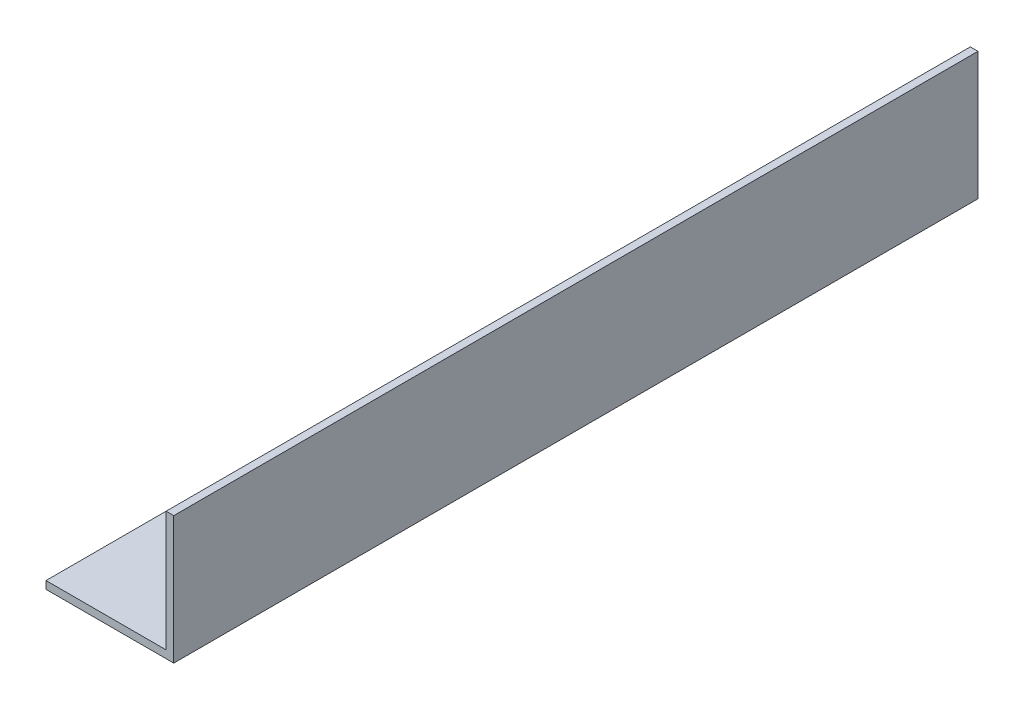
ISO-10303-21;
HEADER;
FILE_DESCRIPTION(('STEP AP214'),'2;1');
FILE_NAME('part.step','',(''),(''),'','','');
FILE_SCHEMA(('AUTOMOTIVE_DESIGN { 1 0 10303 214 1 1 1 1 }'));
ENDSEC;
DATA;
#1=APPLICATION_CONTEXT('core data for automotive mechanical design processes');
#2=APPLICATION_PROTOCOL_DEFINITION('international standard','automotive_design',2000,#1);
#3=PRODUCT_CONTEXT('',#1,'mechanical');
#4=PRODUCT('Part','Part','',(#3));
#5=PRODUCT_RELATED_PRODUCT_CATEGORY('part','',(#4));
#6=PRODUCT_DEFINITION_FORMATION('','',#4);
#7=PRODUCT_DEFINITION_CONTEXT('part definition',#1,'design');
#8=PRODUCT_DEFINITION('design','',#6,#7);
#9=PRODUCT_DEFINITION_SHAPE('','',#8);
#10=(LENGTH_UNIT() NAMED_UNIT(*) SI_UNIT(.MILLI.,.METRE.));
#11=(NAMED_UNIT(*) PLANE_ANGLE_UNIT() SI_UNIT($,.RADIAN.));
#12=(NAMED_UNIT(*) SI_UNIT($,.STERADIAN.) SOLID_ANGLE_UNIT());
#13=UNCERTAINTY_MEASURE_WITH_UNIT(LENGTH_MEASURE(1.E-05),#10,'distance_accuracy_value','');
#14=(GEOMETRIC_REPRESENTATION_CONTEXT(3) GLOBAL_UNCERTAINTY_ASSIGNED_CONTEXT((#13)) GLOBAL_UNIT_ASSIGNED_CONTEXT((#10,
#11,#12)) REPRESENTATION_CONTEXT('',''));
#15=CARTESIAN_POINT('',(0.,0.,0.));
#16=DIRECTION('',(0.,0.,1.));
#17=DIRECTION('',(1.,0.,0.));
#18=AXIS2_PLACEMENT_3D('',#15,#16,#17);
#19=CARTESIAN_POINT('',(-50.,0.,-304.8));
#20=DIRECTION('',(-1.,0.,0.));
#21=DIRECTION('',(0.,0.,1.));
#22=AXIS2_PLACEMENT_3D('',#19,#20,#21);
#23=PLANE('',#22);
#24=DIRECTION('',(0.,0.,1.));
#25=VECTOR('',#24,1.);
#26=CARTESIAN_POINT('',(-50.,0.,-304.8));
#27=LINE('',#26,#25);
#28=CARTESIAN_POINT('',(-50.,0.,-304.8));
#29=VERTEX_POINT('',#28);
#30=CARTESIAN_POINT('',(-50.,0.,10.));
#31=VERTEX_POINT('',#30);
#32=EDGE_CURVE('E44',#29,#31,#27,.T.);
#33=ORIENTED_EDGE('',*,*,#32,.T.);
#34=DIRECTION('',(0.,-1.,0.));
#35=VECTOR('',#34,1.);
#36=CARTESIAN_POINT('',(-50.,0.,10.));
#37=LINE('',#36,#35);
#38=CARTESIAN_POINT('',(-50.,2.99999999999999,10.));
#39=VERTEX_POINT('',#38);
#40=EDGE_CURVE('E93',#39,#31,#37,.T.);
#41=ORIENTED_EDGE('',*,*,#40,.F.);
#42=DIRECTION('',(0.,0.,1.));
#43=VECTOR('',#42,1.);
#44=CARTESIAN_POINT('',(-50.,2.99999999999999,-304.8));
#45=LINE('',#44,#43);
#46=CARTESIAN_POINT('',(-50.,2.99999999999999,-304.8));
#47=VERTEX_POINT('',#46);
#48=EDGE_CURVE('E11',#47,#39,#45,.T.);
#49=ORIENTED_EDGE('',*,*,#48,.F.);
#50=DIRECTION('',(0.,-1.,0.));
#51=VECTOR('',#50,1.);
#52=CARTESIAN_POINT('',(-50.,0.,-304.8));
#53=LINE('',#52,#51);
#54=EDGE_CURVE('E94',#47,#29,#53,.T.);
#55=ORIENTED_EDGE('',*,*,#54,.T.);
#56=EDGE_LOOP('',(#33,#41,#49,#55));
#57=FACE_BOUND('',#56,.T.);
#58=ADVANCED_FACE('F41',(#57),#23,.T.);
#59=CARTESIAN_POINT('',(-2.99999999999999,3.,-304.8));
#60=DIRECTION('',(0.,1.,0.));
#61=DIRECTION('',(-1.,0.,0.));
#62=AXIS2_PLACEMENT_3D('',#59,#60,#61);
#63=PLANE('',#62);
#64=CARTESIAN_POINT('',(-37.,3.,-110.61));
#65=DIRECTION('',(0.,1.,0.));
#66=DIRECTION('',(-1.,0.,0.));
#67=AXIS2_PLACEMENT_3D('',#64,#65,#66);
#68=CIRCLE('',#67,2.58499999999999);
#69=CARTESIAN_POINT('',(-39.585,3.,-110.61));
#70=VERTEX_POINT('',#69);
#71=EDGE_CURVE('E112',#70,#70,#68,.F.);
#72=ORIENTED_EDGE('',*,*,#71,.T.);
#73=EDGE_LOOP('',(#72));
#74=FACE_BOUND('',#73,.T.);
#75=CARTESIAN_POINT('',(-16.,3.,-184.19));
#76=DIRECTION('',(0.,1.,0.));
#77=DIRECTION('',(-1.,0.,0.));
#78=AXIS2_PLACEMENT_3D('',#75,#76,#77);
#79=CIRCLE('',#78,2.58499999999999);
#80=CARTESIAN_POINT('',(-18.585,3.,-184.19));
#81=VERTEX_POINT('',#80);
#82=EDGE_CURVE('E115',#81,#81,#79,.F.);
#83=ORIENTED_EDGE('',*,*,#82,.T.);
#84=EDGE_LOOP('',(#83));
#85=FACE_BOUND('',#84,.T.);
#86=CARTESIAN_POINT('',(-37.,3.,-184.19));
#87=DIRECTION('',(0.,1.,0.));
#88=DIRECTION('',(-1.,0.,0.));
#89=AXIS2_PLACEMENT_3D('',#86,#87,#88);
#90=CIRCLE('',#89,2.58499999999999);
#91=CARTESIAN_POINT('',(-39.585,3.,-184.19));
#92=VERTEX_POINT('',#91);
#93=EDGE_CURVE('E230',#92,#92,#90,.F.);
#94=ORIENTED_EDGE('',*,*,#93,.T.);
#95=EDGE_LOOP('',(#94));
#96=FACE_BOUND('',#95,.T.);
#97=CARTESIAN_POINT('',(-16.,3.,-156.19));
#98=DIRECTION('',(0.,1.,0.));
#99=DIRECTION('',(-1.,0.,0.));
#100=AXIS2_PLACEMENT_3D('',#97,#98,#99);
#101=CIRCLE('',#100,2.58499999999999);
#102=CARTESIAN_POINT('',(-18.585,3.,-156.19));
#103=VERTEX_POINT('',#102);
#104=EDGE_CURVE('E227',#103,#103,#101,.F.);
#105=ORIENTED_EDGE('',*,*,#104,.T.);
#106=EDGE_LOOP('',(#105));
#107=FACE_BOUND('',#106,.T.);
#108=CARTESIAN_POINT('',(-16.,3.,-110.61));
#109=DIRECTION('',(0.,1.,0.));
#110=DIRECTION('',(-1.,0.,0.));
#111=AXIS2_PLACEMENT_3D('',#108,#109,#110);
#112=CIRCLE('',#111,2.58499999999999);
#113=CARTESIAN_POINT('',(-18.585,3.,-110.61));
#114=VERTEX_POINT('',#113);
#115=EDGE_CURVE('E224',#114,#114,#112,.F.);
#116=ORIENTED_EDGE('',*,*,#115,.T.);
#117=EDGE_LOOP('',(#116));
#118=FACE_BOUND('',#117,.T.);
#119=CARTESIAN_POINT('',(-16.,3.,-138.61));
#120=DIRECTION('',(0.,1.,0.));
#121=DIRECTION('',(-1.,0.,0.));
#122=AXIS2_PLACEMENT_3D('',#119,#120,#121);
#123=CIRCLE('',#122,2.58499999999999);
#124=CARTESIAN_POINT('',(-18.585,3.,-138.61));
#125=VERTEX_POINT('',#124);
#126=EDGE_CURVE('E221',#125,#125,#123,.F.);
#127=ORIENTED_EDGE('',*,*,#126,.T.);
#128=EDGE_LOOP('',(#127));
#129=FACE_BOUND('',#128,.T.);
#130=CARTESIAN_POINT('',(-37.,3.,-138.61));
#131=DIRECTION('',(0.,1.,0.));
#132=DIRECTION('',(-1.,0.,0.));
#133=AXIS2_PLACEMENT_3D('',#130,#131,#132);
#134=CIRCLE('',#133,2.58499999999998);
#135=CARTESIAN_POINT('',(-39.585,3.,-138.61));
#136=VERTEX_POINT('',#135);
#137=EDGE_CURVE('E214',#136,#136,#134,.F.);
#138=ORIENTED_EDGE('',*,*,#137,.T.);
#139=EDGE_LOOP('',(#138));
#140=FACE_BOUND('',#139,.T.);
#141=CARTESIAN_POINT('',(-37.,3.,-156.19));
#142=DIRECTION('',(0.,1.,0.));
#143=DIRECTION('',(-1.,0.,0.));
#144=AXIS2_PLACEMENT_3D('',#141,#142,#143);
#145=CIRCLE('',#144,2.58499999999998);
#146=CARTESIAN_POINT('',(-39.585,3.,-156.19));
#147=VERTEX_POINT('',#146);
#148=EDGE_CURVE('E211',#147,#147,#145,.F.);
#149=ORIENTED_EDGE('',*,*,#148,.T.);
#150=EDGE_LOOP('',(#149));
#151=FACE_BOUND('',#150,.T.);
#152=ORIENTED_EDGE('',*,*,#48,.T.);
#153=DIRECTION('',(-1.,0.,0.));
#154=VECTOR('',#153,1.);
#155=CARTESIAN_POINT('',(-2.99999999999999,3.,10.));
#156=LINE('',#155,#154);
#157=CARTESIAN_POINT('',(-2.99999999999999,3.,10.));
#158=VERTEX_POINT('',#157);
#159=EDGE_CURVE('E111',#158,#39,#156,.T.);
#160=ORIENTED_EDGE('',*,*,#159,.F.);
#161=DIRECTION('',(0.,0.,1.));
#162=VECTOR('',#161,1.);
#163=CARTESIAN_POINT('',(-2.99999999999999,3.,-304.8));
#164=LINE('',#163,#162);
#165=CARTESIAN_POINT('',(-2.99999999999999,3.,-304.8));
#166=VERTEX_POINT('',#165);
#167=EDGE_CURVE('E49',#166,#158,#164,.T.);
#168=ORIENTED_EDGE('',*,*,#167,.F.);
#169=DIRECTION('',(-1.,0.,0.));
#170=VECTOR('',#169,1.);
#171=CARTESIAN_POINT('',(-2.99999999999999,3.,-304.8));
#172=LINE('',#171,#170);
#173=EDGE_CURVE('E99',#166,#47,#172,.T.);
#174=ORIENTED_EDGE('',*,*,#173,.T.);
#175=EDGE_LOOP('',(#152,#160,#168,#174));
#176=FACE_BOUND('',#175,.T.);
#177=ADVANCED_FACE('F156',(#74,#85,#96,#107,#118,#129,#140,#151,#176),#63,.T.);
#178=CARTESIAN_POINT('',(-2.99999999999999,50.,-304.8));
#179=DIRECTION('',(-1.,0.,0.));
#180=DIRECTION('',(0.,-1.,0.));
#181=AXIS2_PLACEMENT_3D('',#178,#179,#180);
#182=PLANE('',#181);
#183=ORIENTED_EDGE('',*,*,#167,.T.);
#184=DIRECTION('',(0.,-1.,0.));
#185=VECTOR('',#184,1.);
#186=CARTESIAN_POINT('',(-2.99999999999999,50.,10.));
#187=LINE('',#186,#185);
#188=CARTESIAN_POINT('',(-2.99999999999999,50.,10.));
#189=VERTEX_POINT('',#188);
#190=EDGE_CURVE('E123',#189,#158,#187,.T.);
#191=ORIENTED_EDGE('',*,*,#190,.F.);
#192=DIRECTION('',(0.,0.,1.));
#193=VECTOR('',#192,1.);
#194=CARTESIAN_POINT('',(-2.99999999999999,50.,-304.8));
#195=LINE('',#194,#193);
#196=CARTESIAN_POINT('',(-2.99999999999999,50.,-304.8));
#197=VERTEX_POINT('',#196);
#198=EDGE_CURVE('E139',#197,#189,#195,.T.);
#199=ORIENTED_EDGE('',*,*,#198,.F.);
#200=DIRECTION('',(0.,-1.,0.));
#201=VECTOR('',#200,1.);
#202=CARTESIAN_POINT('',(-2.99999999999999,50.,-304.8));
#203=LINE('',#202,#201);
#204=EDGE_CURVE('E135',#197,#166,#203,.T.);
#205=ORIENTED_EDGE('',*,*,#204,.T.);
#206=EDGE_LOOP('',(#183,#191,#199,#205));
#207=FACE_BOUND('',#206,.T.);
#208=ADVANCED_FACE('F152',(#207),#182,.T.);
#209=CARTESIAN_POINT('',(0.,50.,-304.8));
#210=DIRECTION('',(0.,1.,0.));
#211=DIRECTION('',(0.,0.,1.));
#212=AXIS2_PLACEMENT_3D('',#209,#210,#211);
#213=PLANE('',#212);
#214=ORIENTED_EDGE('',*,*,#198,.T.);
#215=DIRECTION('',(-1.,0.,0.));
#216=VECTOR('',#215,1.);
#217=CARTESIAN_POINT('',(0.,50.,10.));
#218=LINE('',#217,#216);
#219=CARTESIAN_POINT('',(0.,50.,10.));
#220=VERTEX_POINT('',#219);
#221=EDGE_CURVE('E120',#220,#189,#218,.T.);
#222=ORIENTED_EDGE('',*,*,#221,.F.);
#223=DIRECTION('',(0.,0.,1.));
#224=VECTOR('',#223,1.);
#225=CARTESIAN_POINT('',(0.,50.,-304.8));
#226=LINE('',#225,#224);
#227=CARTESIAN_POINT('',(0.,50.,-304.8));
#228=VERTEX_POINT('',#227);
#229=EDGE_CURVE('E141',#228,#220,#226,.T.);
#230=ORIENTED_EDGE('',*,*,#229,.F.);
#231=DIRECTION('',(-1.,0.,0.));
#232=VECTOR('',#231,1.);
#233=CARTESIAN_POINT('',(0.,50.,-304.8));
#234=LINE('',#233,#232);
#235=EDGE_CURVE('E132',#228,#197,#234,.T.);
#236=ORIENTED_EDGE('',*,*,#235,.T.);
#237=EDGE_LOOP('',(#214,#222,#230,#236));
#238=FACE_BOUND('',#237,.T.);
#239=ADVANCED_FACE('F149',(#238),#213,.T.);
#240=CARTESIAN_POINT('',(0.,0.,-304.8));
#241=DIRECTION('',(1.,0.,0.));
#242=DIRECTION('',(0.,0.,-1.));
#243=AXIS2_PLACEMENT_3D('',#240,#241,#242);
#244=PLANE('',#243);
#245=ORIENTED_EDGE('',*,*,#229,.T.);
#246=DIRECTION('',(0.,1.,0.));
#247=VECTOR('',#246,1.);
#248=CARTESIAN_POINT('',(0.,0.,10.));
#249=LINE('',#248,#247);
#250=CARTESIAN_POINT('',(0.,0.,10.));
#251=VERTEX_POINT('',#250);
#252=EDGE_CURVE('E106',#251,#220,#249,.T.);
#253=ORIENTED_EDGE('',*,*,#252,.F.);
#254=DIRECTION('',(0.,0.,1.));
#255=VECTOR('',#254,1.);
#256=CARTESIAN_POINT('',(0.,0.,-304.8));
#257=LINE('',#256,#255);
#258=CARTESIAN_POINT('',(0.,0.,-304.8));
#259=VERTEX_POINT('',#258);
#260=EDGE_CURVE('E98',#259,#251,#257,.T.);
#261=ORIENTED_EDGE('',*,*,#260,.F.);
#262=DIRECTION('',(0.,1.,0.));
#263=VECTOR('',#262,1.);
#264=CARTESIAN_POINT('',(0.,0.,-304.8));
#265=LINE('',#264,#263);
#266=EDGE_CURVE('E129',#259,#228,#265,.T.);
#267=ORIENTED_EDGE('',*,*,#266,.T.);
#268=EDGE_LOOP('',(#245,#253,#261,#267));
#269=FACE_BOUND('',#268,.T.);
#270=ADVANCED_FACE('F143',(#269),#244,.T.);
#271=CARTESIAN_POINT('',(-50.,0.,-304.8));
#272=DIRECTION('',(0.,-1.,0.));
#273=DIRECTION('',(0.,0.,-1.));
#274=AXIS2_PLACEMENT_3D('',#271,#272,#273);
#275=PLANE('',#274);
#276=CARTESIAN_POINT('',(-37.,0.,-110.61));
#277=DIRECTION('',(0.,1.,0.));
#278=DIRECTION('',(0.,0.,-1.));
#279=AXIS2_PLACEMENT_3D('',#276,#277,#278);
#280=CIRCLE('',#279,2.58499999999999);
#281=CARTESIAN_POINT('',(-37.,0.,-113.195));
#282=VERTEX_POINT('',#281);
#283=EDGE_CURVE('E182',#282,#282,#280,.T.);
#284=ORIENTED_EDGE('',*,*,#283,.T.);
#285=EDGE_LOOP('',(#284));
#286=FACE_BOUND('',#285,.T.);
#287=CARTESIAN_POINT('',(-16.,0.,-184.19));
#288=DIRECTION('',(0.,1.,0.));
#289=DIRECTION('',(0.,0.,-1.));
#290=AXIS2_PLACEMENT_3D('',#287,#288,#289);
#291=CIRCLE('',#290,2.58499999999999);
#292=CARTESIAN_POINT('',(-16.,0.,-186.775));
#293=VERTEX_POINT('',#292);
#294=EDGE_CURVE('E186',#293,#293,#291,.T.);
#295=ORIENTED_EDGE('',*,*,#294,.T.);
#296=EDGE_LOOP('',(#295));
#297=FACE_BOUND('',#296,.T.);
#298=CARTESIAN_POINT('',(-37.,0.,-184.19));
#299=DIRECTION('',(0.,1.,0.));
#300=DIRECTION('',(0.,0.,1.));
#301=AXIS2_PLACEMENT_3D('',#298,#299,#300);
#302=CIRCLE('',#301,2.58499999999999);
#303=CARTESIAN_POINT('',(-37.,0.,-181.605));
#304=VERTEX_POINT('',#303);
#305=EDGE_CURVE('E190',#304,#304,#302,.T.);
#306=ORIENTED_EDGE('',*,*,#305,.T.);
#307=EDGE_LOOP('',(#306));
#308=FACE_BOUND('',#307,.T.);
#309=CARTESIAN_POINT('',(-16.,0.,-156.19));
#310=DIRECTION('',(0.,1.,0.));
#311=DIRECTION('',(0.,0.,-1.));
#312=AXIS2_PLACEMENT_3D('',#309,#310,#311);
#313=CIRCLE('',#312,2.58499999999999);
#314=CARTESIAN_POINT('',(-16.,0.,-158.775));
#315=VERTEX_POINT('',#314);
#316=EDGE_CURVE('E194',#315,#315,#313,.T.);
#317=ORIENTED_EDGE('',*,*,#316,.T.);
#318=EDGE_LOOP('',(#317));
#319=FACE_BOUND('',#318,.T.);
#320=CARTESIAN_POINT('',(-16.,0.,-110.61));
#321=DIRECTION('',(0.,1.,0.));
#322=DIRECTION('',(0.,0.,1.));
#323=AXIS2_PLACEMENT_3D('',#320,#321,#322);
#324=CIRCLE('',#323,2.58499999999999);
#325=CARTESIAN_POINT('',(-16.,0.,-108.025));
#326=VERTEX_POINT('',#325);
#327=EDGE_CURVE('E198',#326,#326,#324,.T.);
#328=ORIENTED_EDGE('',*,*,#327,.T.);
#329=EDGE_LOOP('',(#328));
#330=FACE_BOUND('',#329,.T.);
#331=CARTESIAN_POINT('',(-16.,0.,-138.61));
#332=DIRECTION('',(0.,1.,0.));
#333=DIRECTION('',(0.,0.,1.));
#334=AXIS2_PLACEMENT_3D('',#331,#332,#333);
#335=CIRCLE('',#334,2.58499999999999);
#336=CARTESIAN_POINT('',(-16.,0.,-136.025));
#337=VERTEX_POINT('',#336);
#338=EDGE_CURVE('E202',#337,#337,#335,.T.);
#339=ORIENTED_EDGE('',*,*,#338,.T.);
#340=EDGE_LOOP('',(#339));
#341=FACE_BOUND('',#340,.T.);
#342=CARTESIAN_POINT('',(-37.,0.,-138.61));
#343=DIRECTION('',(0.,1.,0.));
#344=DIRECTION('',(0.,0.,-1.));
#345=AXIS2_PLACEMENT_3D('',#342,#343,#344);
#346=CIRCLE('',#345,2.58499999999998);
#347=CARTESIAN_POINT('',(-37.,0.,-141.195));
#348=VERTEX_POINT('',#347);
#349=EDGE_CURVE('E206',#348,#348,#346,.T.);
#350=ORIENTED_EDGE('',*,*,#349,.T.);
#351=EDGE_LOOP('',(#350));
#352=FACE_BOUND('',#351,.T.);
#353=CARTESIAN_POINT('',(-37.,0.,-156.19));
#354=DIRECTION('',(0.,1.,0.));
#355=DIRECTION('',(0.,0.,1.));
#356=AXIS2_PLACEMENT_3D('',#353,#354,#355);
#357=CIRCLE('',#356,2.58499999999998);
#358=CARTESIAN_POINT('',(-37.,0.,-153.605));
#359=VERTEX_POINT('',#358);
#360=EDGE_CURVE('E209',#359,#359,#357,.T.);
#361=ORIENTED_EDGE('',*,*,#360,.T.);
#362=EDGE_LOOP('',(#361));
#363=FACE_BOUND('',#362,.T.);
#364=ORIENTED_EDGE('',*,*,#260,.T.);
#365=DIRECTION('',(1.,0.,0.));
#366=VECTOR('',#365,1.);
#367=CARTESIAN_POINT('',(-50.,0.,10.));
#368=LINE('',#367,#366);
#369=EDGE_CURVE('E101',#31,#251,#368,.T.);
#370=ORIENTED_EDGE('',*,*,#369,.F.);
#371=ORIENTED_EDGE('',*,*,#32,.F.);
#372=DIRECTION('',(1.,0.,0.));
#373=VECTOR('',#372,1.);
#374=CARTESIAN_POINT('',(-50.,0.,-304.8));
#375=LINE('',#374,#373);
#376=EDGE_CURVE('E127',#29,#259,#375,.T.);
#377=ORIENTED_EDGE('',*,*,#376,.T.);
#378=EDGE_LOOP('',(#364,#370,#371,#377));
#379=FACE_BOUND('',#378,.T.);
#380=ADVANCED_FACE('F102',(#286,#297,#308,#319,#330,#341,#352,#363,#379),#275,.T.);
#381=CARTESIAN_POINT('',(0.,0.,-304.8));
#382=DIRECTION('',(0.,0.,1.));
#383=DIRECTION('',(1.,0.,0.));
#384=AXIS2_PLACEMENT_3D('',#381,#382,#383);
#385=PLANE('',#384);
#386=ORIENTED_EDGE('',*,*,#54,.F.);
#387=ORIENTED_EDGE('',*,*,#173,.F.);
#388=ORIENTED_EDGE('',*,*,#204,.F.);
#389=ORIENTED_EDGE('',*,*,#235,.F.);
#390=ORIENTED_EDGE('',*,*,#266,.F.);
#391=ORIENTED_EDGE('',*,*,#376,.F.);
#392=EDGE_LOOP('',(#386,#387,#388,#389,#390,#391));
#393=FACE_BOUND('',#392,.T.);
#394=ADVANCED_FACE('F155',(#393),#385,.F.);
#395=CARTESIAN_POINT('',(0.,0.,10.));
#396=DIRECTION('',(0.,0.,1.));
#397=DIRECTION('',(1.,0.,0.));
#398=AXIS2_PLACEMENT_3D('',#395,#396,#397);
#399=PLANE('',#398);
#400=ORIENTED_EDGE('',*,*,#40,.T.);
#401=ORIENTED_EDGE('',*,*,#369,.T.);
#402=ORIENTED_EDGE('',*,*,#252,.T.);
#403=ORIENTED_EDGE('',*,*,#221,.T.);
#404=ORIENTED_EDGE('',*,*,#190,.T.);
#405=ORIENTED_EDGE('',*,*,#159,.T.);
#406=EDGE_LOOP('',(#400,#401,#402,#403,#404,#405));
#407=FACE_BOUND('',#406,.T.);
#408=ADVANCED_FACE('F109',(#407),#399,.T.);
#409=CARTESIAN_POINT('',(-37.,50.,-156.19));
#410=DIRECTION('',(0.,-1.,0.));
#411=DIRECTION('',(0.,0.,-1.));
#412=AXIS2_PLACEMENT_3D('',#409,#410,#411);
#413=CYLINDRICAL_SURFACE('',#412,2.58499999999998);
#414=ORIENTED_EDGE('',*,*,#148,.F.);
#415=EDGE_LOOP('',(#414));
#416=FACE_BOUND('',#415,.T.);
#417=ORIENTED_EDGE('',*,*,#360,.F.);
#418=EDGE_LOOP('',(#417));
#419=FACE_BOUND('',#418,.T.);
#420=ADVANCED_FACE('F264',(#416,#419),#413,.F.);
#421=CARTESIAN_POINT('',(-37.,50.,-138.61));
#422=DIRECTION('',(0.,-1.,0.));
#423=DIRECTION('',(0.,0.,-1.));
#424=AXIS2_PLACEMENT_3D('',#421,#422,#423);
#425=CYLINDRICAL_SURFACE('',#424,2.58499999999998);
#426=ORIENTED_EDGE('',*,*,#137,.F.);
#427=EDGE_LOOP('',(#426));
#428=FACE_BOUND('',#427,.T.);
#429=ORIENTED_EDGE('',*,*,#349,.F.);
#430=EDGE_LOOP('',(#429));
#431=FACE_BOUND('',#430,.T.);
#432=ADVANCED_FACE('F257',(#428,#431),#425,.F.);
#433=CARTESIAN_POINT('',(-16.,50.,-138.61));
#434=DIRECTION('',(0.,-1.,0.));
#435=DIRECTION('',(0.,0.,-1.));
#436=AXIS2_PLACEMENT_3D('',#433,#434,#435);
#437=CYLINDRICAL_SURFACE('',#436,2.58499999999999);
#438=ORIENTED_EDGE('',*,*,#126,.F.);
#439=EDGE_LOOP('',(#438));
#440=FACE_BOUND('',#439,.T.);
#441=ORIENTED_EDGE('',*,*,#338,.F.);
#442=EDGE_LOOP('',(#441));
#443=FACE_BOUND('',#442,.T.);
#444=ADVANCED_FACE('F322',(#440,#443),#437,.F.);
#445=CARTESIAN_POINT('',(-16.,50.,-110.61));
#446=DIRECTION('',(0.,-1.,0.));
#447=DIRECTION('',(0.,0.,-1.));
#448=AXIS2_PLACEMENT_3D('',#445,#446,#447);
#449=CYLINDRICAL_SURFACE('',#448,2.58499999999999);
#450=ORIENTED_EDGE('',*,*,#115,.F.);
#451=EDGE_LOOP('',(#450));
#452=FACE_BOUND('',#451,.T.);
#453=ORIENTED_EDGE('',*,*,#327,.F.);
#454=EDGE_LOOP('',(#453));
#455=FACE_BOUND('',#454,.T.);
#456=ADVANCED_FACE('F261',(#452,#455),#449,.F.);
#457=CARTESIAN_POINT('',(-16.,50.,-156.19));
#458=DIRECTION('',(0.,-1.,0.));
#459=DIRECTION('',(0.,0.,-1.));
#460=AXIS2_PLACEMENT_3D('',#457,#458,#459);
#461=CYLINDRICAL_SURFACE('',#460,2.58499999999999);
#462=ORIENTED_EDGE('',*,*,#104,.F.);
#463=EDGE_LOOP('',(#462));
#464=FACE_BOUND('',#463,.T.);
#465=ORIENTED_EDGE('',*,*,#316,.F.);
#466=EDGE_LOOP('',(#465));
#467=FACE_BOUND('',#466,.T.);
#468=ADVANCED_FACE('F253',(#464,#467),#461,.F.);
#469=CARTESIAN_POINT('',(-37.,50.,-184.19));
#470=DIRECTION('',(0.,-1.,0.));
#471=DIRECTION('',(0.,0.,-1.));
#472=AXIS2_PLACEMENT_3D('',#469,#470,#471);
#473=CYLINDRICAL_SURFACE('',#472,2.58499999999999);
#474=ORIENTED_EDGE('',*,*,#93,.F.);
#475=EDGE_LOOP('',(#474));
#476=FACE_BOUND('',#475,.T.);
#477=ORIENTED_EDGE('',*,*,#305,.F.);
#478=EDGE_LOOP('',(#477));
#479=FACE_BOUND('',#478,.T.);
#480=ADVANCED_FACE('F240',(#476,#479),#473,.F.);
#481=CARTESIAN_POINT('',(-16.,50.,-184.19));
#482=DIRECTION('',(0.,-1.,0.));
#483=DIRECTION('',(0.,0.,-1.));
#484=AXIS2_PLACEMENT_3D('',#481,#482,#483);
#485=CYLINDRICAL_SURFACE('',#484,2.58499999999999);
#486=ORIENTED_EDGE('',*,*,#82,.F.);
#487=EDGE_LOOP('',(#486));
#488=FACE_BOUND('',#487,.T.);
#489=ORIENTED_EDGE('',*,*,#294,.F.);
#490=EDGE_LOOP('',(#489));
#491=FACE_BOUND('',#490,.T.);
#492=ADVANCED_FACE('F236',(#488,#491),#485,.F.);
#493=CARTESIAN_POINT('',(-37.,50.,-110.61));
#494=DIRECTION('',(0.,-1.,0.));
#495=DIRECTION('',(0.,0.,-1.));
#496=AXIS2_PLACEMENT_3D('',#493,#494,#495);
#497=CYLINDRICAL_SURFACE('',#496,2.58499999999999);
#498=ORIENTED_EDGE('',*,*,#71,.F.);
#499=EDGE_LOOP('',(#498));
#500=FACE_BOUND('',#499,.T.);
#501=ORIENTED_EDGE('',*,*,#283,.F.);
#502=EDGE_LOOP('',(#501));
#503=FACE_BOUND('',#502,.T.);
#504=ADVANCED_FACE('F239',(#500,#503),#497,.F.);
#505=CLOSED_SHELL('',(#58,#177,#208,#239,#270,#380,#394,#408,#420,#432,#444,#456,#468,#480,#492,#504));
#506=MANIFOLD_SOLID_BREP('B2',#505);
#507=ADVANCED_BREP_SHAPE_REPRESENTATION('',(#18,#506),#14);
#508=SHAPE_DEFINITION_REPRESENTATION(#9,#507);
ENDSEC;
END-ISO-10303-21;
